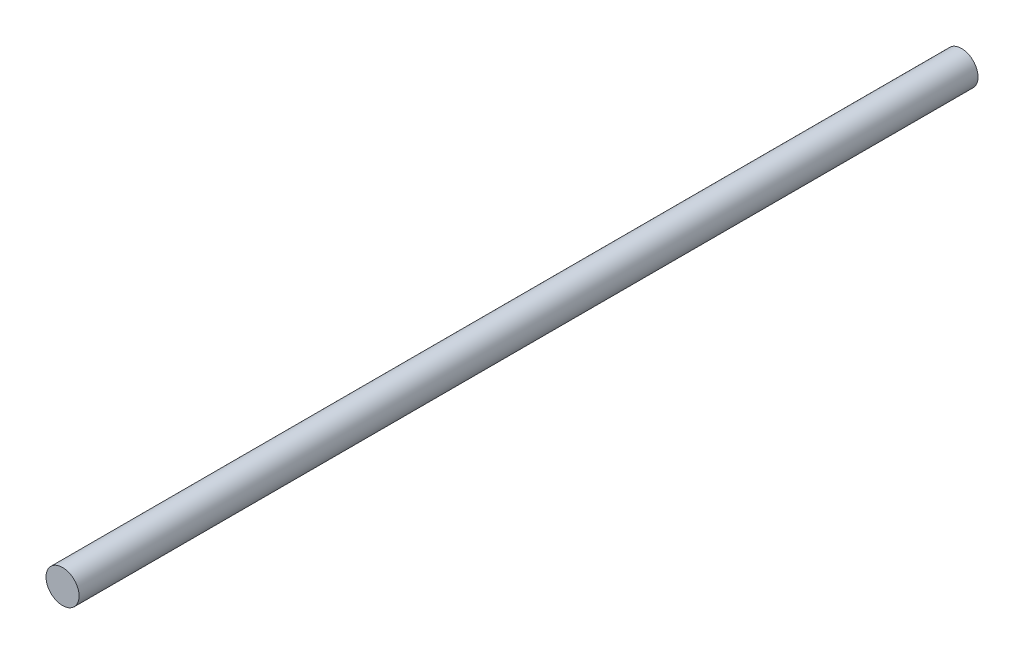
ISO-10303-21;
HEADER;
FILE_DESCRIPTION(('STEP AP214'),'2;1');
FILE_NAME('part.step','',(''),(''),'','','');
FILE_SCHEMA(('AUTOMOTIVE_DESIGN { 1 0 10303 214 1 1 1 1 }'));
ENDSEC;
DATA;
#1=APPLICATION_CONTEXT('core data for automotive mechanical design processes');
#2=APPLICATION_PROTOCOL_DEFINITION('international standard','automotive_design',2000,#1);
#3=PRODUCT_CONTEXT('',#1,'mechanical');
#4=PRODUCT('Part','Part','',(#3));
#5=PRODUCT_RELATED_PRODUCT_CATEGORY('part','',(#4));
#6=PRODUCT_DEFINITION_FORMATION('','',#4);
#7=PRODUCT_DEFINITION_CONTEXT('part definition',#1,'design');
#8=PRODUCT_DEFINITION('design','',#6,#7);
#9=PRODUCT_DEFINITION_SHAPE('','',#8);
#10=(LENGTH_UNIT() NAMED_UNIT(*) SI_UNIT(.MILLI.,.METRE.));
#11=(NAMED_UNIT(*) PLANE_ANGLE_UNIT() SI_UNIT($,.RADIAN.));
#12=(NAMED_UNIT(*) SI_UNIT($,.STERADIAN.) SOLID_ANGLE_UNIT());
#13=UNCERTAINTY_MEASURE_WITH_UNIT(LENGTH_MEASURE(1.E-05),#10,'distance_accuracy_value','');
#14=(GEOMETRIC_REPRESENTATION_CONTEXT(3) GLOBAL_UNCERTAINTY_ASSIGNED_CONTEXT((#13)) GLOBAL_UNIT_ASSIGNED_CONTEXT((#10,
#11,#12)) REPRESENTATION_CONTEXT('',''));
#15=CARTESIAN_POINT('',(0.,0.,0.));
#16=DIRECTION('',(0.,0.,1.));
#17=DIRECTION('',(1.,0.,0.));
#18=AXIS2_PLACEMENT_3D('',#15,#16,#17);
#19=CARTESIAN_POINT('',(0.,0.,1196.25));
#20=DIRECTION('',(0.,0.,-1.));
#21=DIRECTION('',(-1.,0.,0.));
#22=AXIS2_PLACEMENT_3D('',#19,#20,#21);
#23=CYLINDRICAL_SURFACE('',#22,40.);
#24=CARTESIAN_POINT('',(0.,0.,1196.25));
#25=DIRECTION('',(0.,0.,1.));
#26=DIRECTION('',(1.,0.,0.));
#27=AXIS2_PLACEMENT_3D('',#24,#25,#26);
#28=CIRCLE('',#27,40.);
#29=CARTESIAN_POINT('',(-40.,0.,1196.25));
#30=VERTEX_POINT('',#29);
#31=EDGE_CURVE('E10',#30,#30,#28,.T.);
#32=CARTESIAN_POINT('',(0.,0.,-978.75));
#33=DIRECTION('',(0.,0.,1.));
#34=DIRECTION('',(1.,0.,0.));
#35=AXIS2_PLACEMENT_3D('',#32,#33,#34);
#36=CIRCLE('',#35,40.);
#37=CARTESIAN_POINT('',(-40.,0.,-978.75));
#38=VERTEX_POINT('',#37);
#39=EDGE_CURVE('E46',#38,#38,#36,.T.);
#40=CARTESIAN_POINT('',(-40.,0.,1196.25));
#41=CARTESIAN_POINT('',(-40.,0.,1173.59375));
#42=CARTESIAN_POINT('',(-40.,0.,1150.9375));
#43=CARTESIAN_POINT('',(-40.,0.,1105.625));
#44=CARTESIAN_POINT('',(-40.,0.,1082.96875));
#45=CARTESIAN_POINT('',(-40.,0.,1037.65625));
#46=CARTESIAN_POINT('',(-40.,0.,1015.));
#47=CARTESIAN_POINT('',(-40.,0.,969.6875));
#48=CARTESIAN_POINT('',(-40.,0.,947.03125));
#49=CARTESIAN_POINT('',(-40.,0.,901.71875));
#50=CARTESIAN_POINT('',(-40.,0.,879.0625));
#51=CARTESIAN_POINT('',(-40.,0.,833.75));
#52=CARTESIAN_POINT('',(-40.,0.,811.09375));
#53=CARTESIAN_POINT('',(-40.,0.,765.78125));
#54=CARTESIAN_POINT('',(-40.,0.,743.125));
#55=CARTESIAN_POINT('',(-40.,0.,697.8125));
#56=CARTESIAN_POINT('',(-40.,0.,675.15625));
#57=CARTESIAN_POINT('',(-40.,0.,629.84375));
#58=CARTESIAN_POINT('',(-40.,0.,607.1875));
#59=CARTESIAN_POINT('',(-40.,0.,561.875));
#60=CARTESIAN_POINT('',(-40.,0.,539.21875));
#61=CARTESIAN_POINT('',(-40.,0.,493.90625));
#62=CARTESIAN_POINT('',(-40.,0.,471.25));
#63=CARTESIAN_POINT('',(-40.,0.,425.9375));
#64=CARTESIAN_POINT('',(-40.,0.,403.28125));
#65=CARTESIAN_POINT('',(-40.,0.,357.96875));
#66=CARTESIAN_POINT('',(-40.,0.,335.312499999999));
#67=CARTESIAN_POINT('',(-40.,0.,290.));
#68=CARTESIAN_POINT('',(-40.,0.,267.343749999999));
#69=CARTESIAN_POINT('',(-40.,0.,222.03125));
#70=CARTESIAN_POINT('',(-40.,0.,199.375));
#71=CARTESIAN_POINT('',(-40.,0.,154.0625));
#72=CARTESIAN_POINT('',(-40.,0.,131.40625));
#73=CARTESIAN_POINT('',(-40.,0.,86.0937499999997));
#74=CARTESIAN_POINT('',(-40.,0.,63.4374999999997));
#75=CARTESIAN_POINT('',(-40.,0.,18.1249999999997));
#76=CARTESIAN_POINT('',(-40.,0.,-4.53125000000032));
#77=CARTESIAN_POINT('',(-40.,0.,-49.8437500000004));
#78=CARTESIAN_POINT('',(-40.,0.,-72.5000000000005));
#79=CARTESIAN_POINT('',(-40.,0.,-117.8125));
#80=CARTESIAN_POINT('',(-40.,0.,-140.46875));
#81=CARTESIAN_POINT('',(-40.,0.,-185.78125));
#82=CARTESIAN_POINT('',(-40.,0.,-208.4375));
#83=CARTESIAN_POINT('',(-40.,0.,-253.75));
#84=CARTESIAN_POINT('',(-40.,0.,-276.40625));
#85=CARTESIAN_POINT('',(-40.,0.,-321.718750000001));
#86=CARTESIAN_POINT('',(-40.,0.,-344.375000000001));
#87=CARTESIAN_POINT('',(-40.,0.,-389.687500000001));
#88=CARTESIAN_POINT('',(-40.,0.,-412.343750000001));
#89=CARTESIAN_POINT('',(-40.,0.,-457.656250000001));
#90=CARTESIAN_POINT('',(-40.,0.,-480.3125));
#91=CARTESIAN_POINT('',(-40.,0.,-525.625));
#92=CARTESIAN_POINT('',(-40.,0.,-548.28125));
#93=CARTESIAN_POINT('',(-40.,0.,-593.593750000001));
#94=CARTESIAN_POINT('',(-40.,0.,-616.250000000001));
#95=CARTESIAN_POINT('',(-40.,0.,-661.562500000001));
#96=CARTESIAN_POINT('',(-40.,0.,-684.218750000001));
#97=CARTESIAN_POINT('',(-40.,0.,-729.531250000001));
#98=CARTESIAN_POINT('',(-40.,0.,-752.187500000001));
#99=CARTESIAN_POINT('',(-40.,0.,-797.500000000001));
#100=CARTESIAN_POINT('',(-40.,0.,-820.156250000001));
#101=CARTESIAN_POINT('',(-40.,0.,-865.468750000001));
#102=CARTESIAN_POINT('',(-40.,0.,-888.125000000001));
#103=CARTESIAN_POINT('',(-40.,0.,-933.4375));
#104=CARTESIAN_POINT('',(-40.,0.,-956.09375));
#105=CARTESIAN_POINT('',(-40.,0.,-978.75));
#106=B_SPLINE_CURVE_WITH_KNOTS('',3,(#40,#41,#42,#43,#44,#45,#46,#47,#48,#49,#50,#51,#52,#53,
#54,#55,#56,#57,#58,#59,#60,#61,#62,#63,#64,#65,#66,#67,#68,#69,#70,#71,#72,#73,#74,#75,#76,#77,
#78,#79,#80,#81,#82,#83,#84,#85,#86,#87,#88,#89,#90,#91,#92,#93,#94,#95,#96,#97,#98,#99,#100,
#101,#102,#103,#104,#105),.UNSPECIFIED.,.F.,.F.,(4,2,2,2,2,2,2,2,2,2,2,2,2,2,2,2,2,2,2,2,2,2,2,
2,2,2,2,2,2,2,2,2,4),(0.,67.9687500000001,135.9375,203.90625,271.875,339.84375,407.8125,
475.78125,543.75,611.71875,679.6875,747.65625,815.625,883.59375,951.5625,1019.53125,1087.5,
1155.46875,1223.4375,1291.40625,1359.375,1427.34375,1495.3125,1563.28125,1631.25,1699.21875,
1767.1875,1835.15625,1903.125,1971.09375,2039.0625,2107.03125,2175.),.UNSPECIFIED.);
#107=EDGE_CURVE('BSEAM43',#30,#38,#106,.T.);
#108=ORIENTED_EDGE('',*,*,#31,.F.);
#109=ORIENTED_EDGE('',*,*,#39,.T.);
#110=ORIENTED_EDGE('',*,*,#107,.T.);
#111=ORIENTED_EDGE('',*,*,#107,.F.);
#112=EDGE_LOOP('',(#108,#110,#109,#111));
#113=FACE_BOUND('',#112,.T.);
#114=ADVANCED_FACE('F43',(#113),#23,.T.);
#115=CARTESIAN_POINT('',(0.,0.,1196.25));
#116=DIRECTION('',(0.,0.,1.));
#117=DIRECTION('',(1.,0.,0.));
#118=AXIS2_PLACEMENT_3D('',#115,#116,#117);
#119=PLANE('',#118);
#120=ORIENTED_EDGE('',*,*,#31,.T.);
#121=EDGE_LOOP('',(#120));
#122=FACE_BOUND('',#121,.T.);
#123=ADVANCED_FACE('F60',(#122),#119,.T.);
#124=CARTESIAN_POINT('',(0.,0.,-978.75));
#125=DIRECTION('',(0.,0.,1.));
#126=DIRECTION('',(1.,0.,0.));
#127=AXIS2_PLACEMENT_3D('',#124,#125,#126);
#128=PLANE('',#127);
#129=ORIENTED_EDGE('',*,*,#39,.F.);
#130=EDGE_LOOP('',(#129));
#131=FACE_BOUND('',#130,.T.);
#132=ADVANCED_FACE('F58',(#131),#128,.F.);
#133=CLOSED_SHELL('',(#114,#123,#132));
#134=MANIFOLD_SOLID_BREP('B2',#133);
#135=ADVANCED_BREP_SHAPE_REPRESENTATION('',(#18,#134),#14);
#136=SHAPE_DEFINITION_REPRESENTATION(#9,#135);
ENDSEC;
END-ISO-10303-21;
